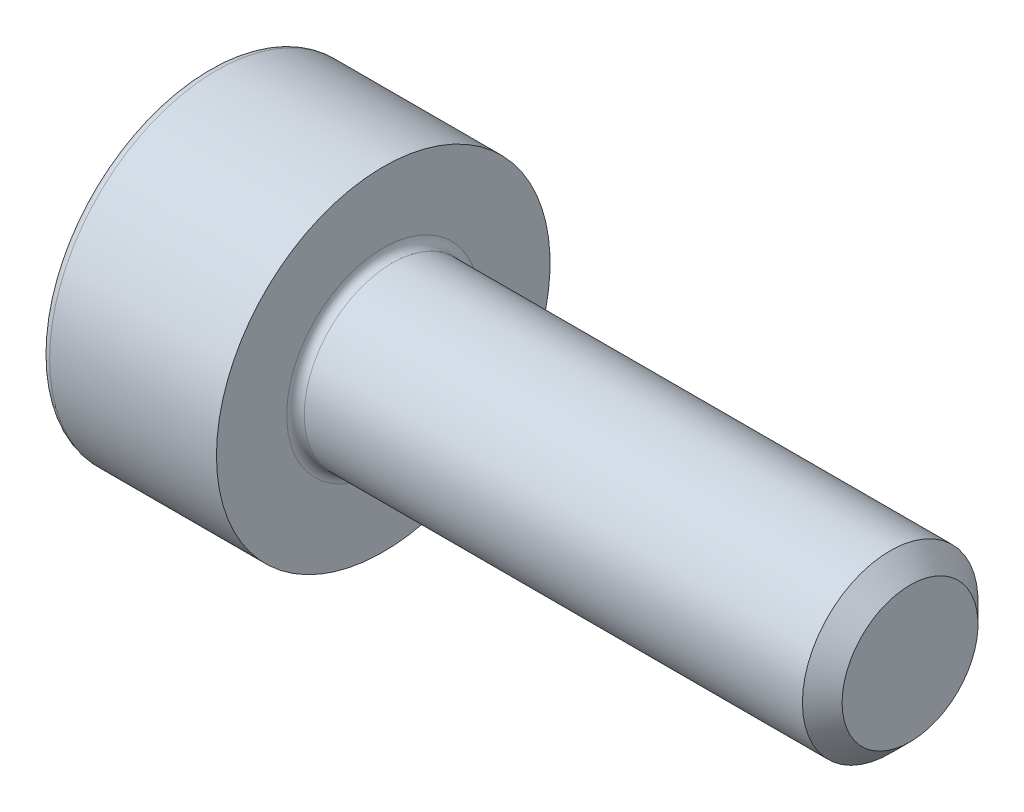
ISO-10303-21;
HEADER;
FILE_DESCRIPTION(('STEP AP214'),'2;1');
FILE_NAME('part.step','',(''),(''),'','','');
FILE_SCHEMA(('AUTOMOTIVE_DESIGN { 1 0 10303 214 1 1 1 1 }'));
ENDSEC;
DATA;
#1=APPLICATION_CONTEXT('core data for automotive mechanical design processes');
#2=APPLICATION_PROTOCOL_DEFINITION('international standard','automotive_design',2000,#1);
#3=PRODUCT_CONTEXT('',#1,'mechanical');
#4=PRODUCT('Part','Part','',(#3));
#5=PRODUCT_RELATED_PRODUCT_CATEGORY('part','',(#4));
#6=PRODUCT_DEFINITION_FORMATION('','',#4);
#7=PRODUCT_DEFINITION_CONTEXT('part definition',#1,'design');
#8=PRODUCT_DEFINITION('design','',#6,#7);
#9=PRODUCT_DEFINITION_SHAPE('','',#8);
#10=(LENGTH_UNIT() NAMED_UNIT(*) SI_UNIT(.MILLI.,.METRE.));
#11=(NAMED_UNIT(*) PLANE_ANGLE_UNIT() SI_UNIT($,.RADIAN.));
#12=(NAMED_UNIT(*) SI_UNIT($,.STERADIAN.) SOLID_ANGLE_UNIT());
#13=UNCERTAINTY_MEASURE_WITH_UNIT(LENGTH_MEASURE(1.E-05),#10,'distance_accuracy_value','');
#14=(GEOMETRIC_REPRESENTATION_CONTEXT(3) GLOBAL_UNCERTAINTY_ASSIGNED_CONTEXT((#13)) GLOBAL_UNIT_ASSIGNED_CONTEXT((#10,
#11,#12)) REPRESENTATION_CONTEXT('',''));
#15=CARTESIAN_POINT('',(0.,0.,0.));
#16=DIRECTION('',(0.,0.,1.));
#17=DIRECTION('',(1.,0.,0.));
#18=AXIS2_PLACEMENT_3D('',#15,#16,#17);
#19=CARTESIAN_POINT('',(0.,0.,0.));
#20=DIRECTION('',(-1.,0.,0.));
#21=DIRECTION('',(0.,0.,1.));
#22=AXIS2_PLACEMENT_3D('',#19,#20,#21);
#23=PLANE('',#22);
#24=DIRECTION('',(0.,-0.5,0.86602540378444));
#25=VECTOR('',#24,1.);
#26=CARTESIAN_POINT('',(0.,0.892006165897969,0.));
#27=LINE('',#26,#25);
#28=CARTESIAN_POINT('',(0.,0.892006165897969,0.));
#29=VERTEX_POINT('',#28);
#30=CARTESIAN_POINT('',(0.,0.446003082948984,0.7725));
#31=VERTEX_POINT('',#30);
#32=EDGE_CURVE('E253',#29,#31,#27,.T.);
#33=ORIENTED_EDGE('',*,*,#32,.T.);
#34=DIRECTION('',(0.,1.,0.));
#35=VECTOR('',#34,1.);
#36=CARTESIAN_POINT('',(0.,-0.446003082948988,0.7725));
#37=LINE('',#36,#35);
#38=CARTESIAN_POINT('',(0.,-0.446003082948988,0.7725));
#39=VERTEX_POINT('',#38);
#40=EDGE_CURVE('E108',#39,#31,#37,.T.);
#41=ORIENTED_EDGE('',*,*,#40,.F.);
#42=DIRECTION('',(0.,-0.5,-0.866025403784438));
#43=VECTOR('',#42,1.);
#44=CARTESIAN_POINT('',(0.,-0.446003082948988,0.7725));
#45=LINE('',#44,#43);
#46=CARTESIAN_POINT('',(0.,-0.892006165897974,0.));
#47=VERTEX_POINT('',#46);
#48=EDGE_CURVE('E256',#39,#47,#45,.T.);
#49=ORIENTED_EDGE('',*,*,#48,.T.);
#50=DIRECTION('',(0.,0.5,-0.86602540378444));
#51=VECTOR('',#50,1.);
#52=CARTESIAN_POINT('',(0.,-0.892006165897974,0.));
#53=LINE('',#52,#51);
#54=CARTESIAN_POINT('',(0.,-0.44600308294899,-0.7725));
#55=VERTEX_POINT('',#54);
#56=EDGE_CURVE('E259',#47,#55,#53,.T.);
#57=ORIENTED_EDGE('',*,*,#56,.T.);
#58=DIRECTION('',(0.,-1.,0.));
#59=VECTOR('',#58,1.);
#60=CARTESIAN_POINT('',(0.,0.446003082948982,-0.7725));
#61=LINE('',#60,#59);
#62=CARTESIAN_POINT('',(0.,0.446003082948982,-0.7725));
#63=VERTEX_POINT('',#62);
#64=EDGE_CURVE('E262',#63,#55,#61,.T.);
#65=ORIENTED_EDGE('',*,*,#64,.F.);
#66=DIRECTION('',(0.,-0.5,-0.866025403784438));
#67=VECTOR('',#66,1.);
#68=CARTESIAN_POINT('',(0.,0.892006165897969,0.));
#69=LINE('',#68,#67);
#70=EDGE_CURVE('E103',#29,#63,#69,.T.);
#71=ORIENTED_EDGE('',*,*,#70,.F.);
#72=EDGE_LOOP('',(#33,#41,#49,#57,#65,#71));
#73=FACE_BOUND('',#72,.T.);
#74=CARTESIAN_POINT('',(0.,0.,0.));
#75=DIRECTION('',(-1.,0.,0.));
#76=DIRECTION('',(0.,0.,1.));
#77=AXIS2_PLACEMENT_3D('',#74,#75,#76);
#78=CIRCLE('',#77,1.8);
#79=CARTESIAN_POINT('',(0.,0.,1.8));
#80=VERTEX_POINT('',#79);
#81=EDGE_CURVE('E24',#80,#80,#78,.T.);
#82=ORIENTED_EDGE('',*,*,#81,.T.);
#83=EDGE_LOOP('',(#82));
#84=FACE_BOUND('',#83,.T.);
#85=ADVANCED_FACE('F16',(#73,#84),#23,.T.);
#86=CARTESIAN_POINT('',(-31.75,0.,0.));
#87=DIRECTION('',(-1.,0.,0.));
#88=DIRECTION('',(0.,0.,1.));
#89=AXIS2_PLACEMENT_3D('',#86,#87,#88);
#90=CYLINDRICAL_SURFACE('',#89,1.9);
#91=CARTESIAN_POINT('',(0.100000000000003,0.,0.));
#92=DIRECTION('',(-1.,0.,0.));
#93=DIRECTION('',(0.,0.,1.));
#94=AXIS2_PLACEMENT_3D('',#91,#92,#93);
#95=CIRCLE('',#94,1.9);
#96=CARTESIAN_POINT('',(0.100000000000003,0.,1.9));
#97=VERTEX_POINT('',#96);
#98=EDGE_CURVE('E11',#97,#97,#95,.F.);
#99=ORIENTED_EDGE('',*,*,#98,.T.);
#100=EDGE_LOOP('',(#99));
#101=FACE_BOUND('',#100,.T.);
#102=CARTESIAN_POINT('',(2.,0.,0.));
#103=DIRECTION('',(-1.,0.,0.));
#104=DIRECTION('',(0.,0.,1.));
#105=AXIS2_PLACEMENT_3D('',#102,#103,#104);
#106=CIRCLE('',#105,1.9);
#107=CARTESIAN_POINT('',(2.,0.,1.9));
#108=VERTEX_POINT('',#107);
#109=EDGE_CURVE('E126',#108,#108,#106,.T.);
#110=ORIENTED_EDGE('',*,*,#109,.T.);
#111=EDGE_LOOP('',(#110));
#112=FACE_BOUND('',#111,.T.);
#113=ADVANCED_FACE('F152',(#101,#112),#90,.T.);
#114=CARTESIAN_POINT('',(2.,1.9,0.));
#115=DIRECTION('',(1.,0.,0.));
#116=DIRECTION('',(0.,0.,-1.));
#117=AXIS2_PLACEMENT_3D('',#114,#115,#116);
#118=PLANE('',#117);
#119=CARTESIAN_POINT('',(2.,0.,0.));
#120=DIRECTION('',(1.,0.,0.));
#121=DIRECTION('',(0.,0.,-1.));
#122=AXIS2_PLACEMENT_3D('',#119,#120,#121);
#123=CIRCLE('',#122,1.1);
#124=CARTESIAN_POINT('',(2.,0.,-1.1));
#125=VERTEX_POINT('',#124);
#126=EDGE_CURVE('E129',#125,#125,#123,.F.);
#127=ORIENTED_EDGE('',*,*,#126,.T.);
#128=EDGE_LOOP('',(#127));
#129=FACE_BOUND('',#128,.T.);
#130=ORIENTED_EDGE('',*,*,#109,.F.);
#131=EDGE_LOOP('',(#130));
#132=FACE_BOUND('',#131,.T.);
#133=ADVANCED_FACE('F159',(#129,#132),#118,.T.);
#134=CARTESIAN_POINT('',(-31.75,0.,0.));
#135=DIRECTION('',(-1.,0.,0.));
#136=DIRECTION('',(0.,0.,1.));
#137=AXIS2_PLACEMENT_3D('',#134,#135,#136);
#138=CYLINDRICAL_SURFACE('',#137,1.);
#139=CARTESIAN_POINT('',(2.1,0.,0.));
#140=DIRECTION('',(1.,0.,0.));
#141=DIRECTION('',(0.,0.,-1.));
#142=AXIS2_PLACEMENT_3D('',#139,#140,#141);
#143=CIRCLE('',#142,1.);
#144=CARTESIAN_POINT('',(2.1,0.,-1.));
#145=VERTEX_POINT('',#144);
#146=EDGE_CURVE('E132',#145,#145,#143,.T.);
#147=ORIENTED_EDGE('',*,*,#146,.T.);
#148=EDGE_LOOP('',(#147));
#149=FACE_BOUND('',#148,.T.);
#150=CARTESIAN_POINT('',(7.774,0.,0.));
#151=DIRECTION('',(-1.,0.,0.));
#152=DIRECTION('',(0.,0.,1.));
#153=AXIS2_PLACEMENT_3D('',#150,#151,#152);
#154=CIRCLE('',#153,0.999999999999986);
#155=CARTESIAN_POINT('',(7.774,0.,0.999999999999986));
#156=VERTEX_POINT('',#155);
#157=EDGE_CURVE('E123',#156,#156,#154,.T.);
#158=ORIENTED_EDGE('',*,*,#157,.T.);
#159=EDGE_LOOP('',(#158));
#160=FACE_BOUND('',#159,.T.);
#161=ADVANCED_FACE('F165',(#149,#160),#138,.T.);
#162=CARTESIAN_POINT('',(8.,0.,0.));
#163=DIRECTION('',(-1.,0.,0.));
#164=DIRECTION('',(0.,0.,1.));
#165=AXIS2_PLACEMENT_3D('',#162,#163,#164);
#166=CONICAL_SURFACE('',#165,0.774,0.785398163397409);
#167=ORIENTED_EDGE('',*,*,#157,.F.);
#168=EDGE_LOOP('',(#167));
#169=FACE_BOUND('',#168,.T.);
#170=CARTESIAN_POINT('',(8.,0.,0.));
#171=DIRECTION('',(-1.,0.,0.));
#172=DIRECTION('',(0.,0.,1.));
#173=AXIS2_PLACEMENT_3D('',#170,#171,#172);
#174=CIRCLE('',#173,0.774);
#175=CARTESIAN_POINT('',(8.,0.,0.774));
#176=VERTEX_POINT('',#175);
#177=EDGE_CURVE('E119',#176,#176,#174,.T.);
#178=ORIENTED_EDGE('',*,*,#177,.T.);
#179=EDGE_LOOP('',(#178));
#180=FACE_BOUND('',#179,.T.);
#181=ADVANCED_FACE('F169',(#169,#180),#166,.T.);
#182=CARTESIAN_POINT('',(8.,0.774,0.));
#183=DIRECTION('',(1.,0.,0.));
#184=DIRECTION('',(0.,0.,-1.));
#185=AXIS2_PLACEMENT_3D('',#182,#183,#184);
#186=PLANE('',#185);
#187=ORIENTED_EDGE('',*,*,#177,.F.);
#188=EDGE_LOOP('',(#187));
#189=FACE_BOUND('',#188,.T.);
#190=ADVANCED_FACE('F148',(#189),#186,.T.);
#191=CARTESIAN_POINT('',(2.1,0.,0.));
#192=DIRECTION('',(1.,0.,0.));
#193=DIRECTION('',(0.,0.,-1.));
#194=AXIS2_PLACEMENT_3D('',#191,#192,#193);
#195=TOROIDAL_SURFACE('',#194,1.1,0.1);
#196=ORIENTED_EDGE('',*,*,#146,.F.);
#197=EDGE_LOOP('',(#196));
#198=FACE_BOUND('',#197,.T.);
#199=ORIENTED_EDGE('',*,*,#126,.F.);
#200=EDGE_LOOP('',(#199));
#201=FACE_BOUND('',#200,.T.);
#202=ADVANCED_FACE('F139',(#198,#201),#195,.F.);
#203=CARTESIAN_POINT('',(0.100000000000003,0.,0.));
#204=DIRECTION('',(-1.,0.,0.));
#205=DIRECTION('',(0.,0.,1.));
#206=AXIS2_PLACEMENT_3D('',#203,#204,#205);
#207=TOROIDAL_SURFACE('',#206,1.8,0.1);
#208=ORIENTED_EDGE('',*,*,#98,.F.);
#209=EDGE_LOOP('',(#208));
#210=FACE_BOUND('',#209,.T.);
#211=ORIENTED_EDGE('',*,*,#81,.F.);
#212=EDGE_LOOP('',(#211));
#213=FACE_BOUND('',#212,.T.);
#214=ADVANCED_FACE('F18',(#210,#213),#207,.T.);
#215=CARTESIAN_POINT('',(1.,0.892006165897969,0.));
#216=DIRECTION('',(0.,-0.86602540378444,-0.5));
#217=DIRECTION('',(0.,0.5,-0.86602540378444));
#218=AXIS2_PLACEMENT_3D('',#215,#216,#217);
#219=PLANE('',#218);
#220=ORIENTED_EDGE('',*,*,#32,.F.);
#221=DIRECTION('',(-1.,0.,0.));
#222=VECTOR('',#221,1.);
#223=CARTESIAN_POINT('',(1.,0.892006165897969,0.));
#224=LINE('',#223,#222);
#225=CARTESIAN_POINT('',(1.,0.892006165897969,0.));
#226=VERTEX_POINT('',#225);
#227=EDGE_CURVE('E252',#226,#29,#224,.T.);
#228=ORIENTED_EDGE('',*,*,#227,.F.);
#229=DIRECTION('',(0.,-0.5,0.86602540378444));
#230=VECTOR('',#229,1.);
#231=CARTESIAN_POINT('',(1.,0.892006165897969,0.));
#232=LINE('',#231,#230);
#233=CARTESIAN_POINT('',(1.,0.66900462442348,0.38625));
#234=VERTEX_POINT('',#233);
#235=EDGE_CURVE('E31',#226,#234,#232,.T.);
#236=ORIENTED_EDGE('',*,*,#235,.T.);
#237=CARTESIAN_POINT('',(1.,0.446003082948984,0.7725));
#238=VERTEX_POINT('',#237);
#239=EDGE_CURVE('E89',#234,#238,#232,.T.);
#240=ORIENTED_EDGE('',*,*,#239,.T.);
#241=DIRECTION('',(-1.,0.,0.));
#242=VECTOR('',#241,1.);
#243=CARTESIAN_POINT('',(1.,0.446003082948984,0.7725));
#244=LINE('',#243,#242);
#245=EDGE_CURVE('E101',#238,#31,#244,.T.);
#246=ORIENTED_EDGE('',*,*,#245,.T.);
#247=EDGE_LOOP('',(#220,#228,#236,#240,#246));
#248=FACE_BOUND('',#247,.T.);
#249=ADVANCED_FACE('F100',(#248),#219,.T.);
#250=CARTESIAN_POINT('',(1.,-0.446003082948988,0.7725));
#251=DIRECTION('',(0.,0.,1.));
#252=DIRECTION('',(0.,-1.,0.));
#253=AXIS2_PLACEMENT_3D('',#250,#251,#252);
#254=PLANE('',#253);
#255=ORIENTED_EDGE('',*,*,#40,.T.);
#256=ORIENTED_EDGE('',*,*,#245,.F.);
#257=DIRECTION('',(0.,1.,0.));
#258=VECTOR('',#257,1.);
#259=CARTESIAN_POINT('',(1.,-0.446003082948988,0.7725));
#260=LINE('',#259,#258);
#261=CARTESIAN_POINT('',(1.,0.,0.7725));
#262=VERTEX_POINT('',#261);
#263=EDGE_CURVE('E87',#262,#238,#260,.T.);
#264=ORIENTED_EDGE('',*,*,#263,.F.);
#265=CARTESIAN_POINT('',(1.,-0.446003082948988,0.7725));
#266=VERTEX_POINT('',#265);
#267=EDGE_CURVE('E97',#266,#262,#260,.T.);
#268=ORIENTED_EDGE('',*,*,#267,.F.);
#269=DIRECTION('',(-1.,0.,0.));
#270=VECTOR('',#269,1.);
#271=CARTESIAN_POINT('',(1.,-0.446003082948988,0.7725));
#272=LINE('',#271,#270);
#273=EDGE_CURVE('E110',#266,#39,#272,.T.);
#274=ORIENTED_EDGE('',*,*,#273,.T.);
#275=EDGE_LOOP('',(#255,#256,#264,#268,#274));
#276=FACE_BOUND('',#275,.T.);
#277=ADVANCED_FACE('F105',(#276),#254,.F.);
#278=CARTESIAN_POINT('',(1.,-0.446003082948988,0.7725));
#279=DIRECTION('',(0.,0.866025403784438,-0.5));
#280=DIRECTION('',(0.,0.5,0.866025403784438));
#281=AXIS2_PLACEMENT_3D('',#278,#279,#280);
#282=PLANE('',#281);
#283=ORIENTED_EDGE('',*,*,#48,.F.);
#284=ORIENTED_EDGE('',*,*,#273,.F.);
#285=DIRECTION('',(0.,-0.5,-0.866025403784438));
#286=VECTOR('',#285,1.);
#287=CARTESIAN_POINT('',(1.,-0.446003082948988,0.7725));
#288=LINE('',#287,#286);
#289=CARTESIAN_POINT('',(1.,-0.669004624423479,0.38625));
#290=VERTEX_POINT('',#289);
#291=EDGE_CURVE('E233',#266,#290,#288,.T.);
#292=ORIENTED_EDGE('',*,*,#291,.T.);
#293=CARTESIAN_POINT('',(1.,-0.892006165897974,0.));
#294=VERTEX_POINT('',#293);
#295=EDGE_CURVE('E235',#290,#294,#288,.T.);
#296=ORIENTED_EDGE('',*,*,#295,.T.);
#297=DIRECTION('',(-1.,0.,0.));
#298=VECTOR('',#297,1.);
#299=CARTESIAN_POINT('',(1.,-0.892006165897974,0.));
#300=LINE('',#299,#298);
#301=EDGE_CURVE('E115',#294,#47,#300,.T.);
#302=ORIENTED_EDGE('',*,*,#301,.T.);
#303=EDGE_LOOP('',(#283,#284,#292,#296,#302));
#304=FACE_BOUND('',#303,.T.);
#305=ADVANCED_FACE('F182',(#304),#282,.T.);
#306=CARTESIAN_POINT('',(1.,-0.892006165897974,0.));
#307=DIRECTION('',(0.,0.86602540378444,0.5));
#308=DIRECTION('',(0.,-0.5,0.86602540378444));
#309=AXIS2_PLACEMENT_3D('',#306,#307,#308);
#310=PLANE('',#309);
#311=ORIENTED_EDGE('',*,*,#56,.F.);
#312=ORIENTED_EDGE('',*,*,#301,.F.);
#313=DIRECTION('',(0.,0.5,-0.86602540378444));
#314=VECTOR('',#313,1.);
#315=CARTESIAN_POINT('',(1.,-0.892006165897974,0.));
#316=LINE('',#315,#314);
#317=CARTESIAN_POINT('',(1.,-0.669004624423483,-0.38625));
#318=VERTEX_POINT('',#317);
#319=EDGE_CURVE('E238',#294,#318,#316,.T.);
#320=ORIENTED_EDGE('',*,*,#319,.T.);
#321=CARTESIAN_POINT('',(1.,-0.44600308294899,-0.7725));
#322=VERTEX_POINT('',#321);
#323=EDGE_CURVE('E242',#318,#322,#316,.T.);
#324=ORIENTED_EDGE('',*,*,#323,.T.);
#325=DIRECTION('',(-1.,0.,0.));
#326=VECTOR('',#325,1.);
#327=CARTESIAN_POINT('',(1.,-0.44600308294899,-0.7725));
#328=LINE('',#327,#326);
#329=EDGE_CURVE('E271',#322,#55,#328,.T.);
#330=ORIENTED_EDGE('',*,*,#329,.T.);
#331=EDGE_LOOP('',(#311,#312,#320,#324,#330));
#332=FACE_BOUND('',#331,.T.);
#333=ADVANCED_FACE('F185',(#332),#310,.T.);
#334=CARTESIAN_POINT('',(1.,0.446003082948982,-0.7725));
#335=DIRECTION('',(0.,0.,-1.));
#336=DIRECTION('',(0.,1.,0.));
#337=AXIS2_PLACEMENT_3D('',#334,#335,#336);
#338=PLANE('',#337);
#339=ORIENTED_EDGE('',*,*,#64,.T.);
#340=ORIENTED_EDGE('',*,*,#329,.F.);
#341=DIRECTION('',(0.,-1.,0.));
#342=VECTOR('',#341,1.);
#343=CARTESIAN_POINT('',(1.,0.446003082948982,-0.7725));
#344=LINE('',#343,#342);
#345=CARTESIAN_POINT('',(1.,0.,-0.7725));
#346=VERTEX_POINT('',#345);
#347=EDGE_CURVE('E246',#346,#322,#344,.T.);
#348=ORIENTED_EDGE('',*,*,#347,.F.);
#349=CARTESIAN_POINT('',(1.,0.446003082948982,-0.7725));
#350=VERTEX_POINT('',#349);
#351=EDGE_CURVE('E247',#350,#346,#344,.T.);
#352=ORIENTED_EDGE('',*,*,#351,.F.);
#353=DIRECTION('',(-1.,0.,0.));
#354=VECTOR('',#353,1.);
#355=CARTESIAN_POINT('',(1.,0.446003082948982,-0.7725));
#356=LINE('',#355,#354);
#357=EDGE_CURVE('E268',#350,#63,#356,.T.);
#358=ORIENTED_EDGE('',*,*,#357,.T.);
#359=EDGE_LOOP('',(#339,#340,#348,#352,#358));
#360=FACE_BOUND('',#359,.T.);
#361=ADVANCED_FACE('F189',(#360),#338,.F.);
#362=CARTESIAN_POINT('',(1.,0.892006165897969,0.));
#363=DIRECTION('',(0.,0.866025403784438,-0.5));
#364=DIRECTION('',(0.,0.5,0.866025403784438));
#365=AXIS2_PLACEMENT_3D('',#362,#363,#364);
#366=PLANE('',#365);
#367=ORIENTED_EDGE('',*,*,#70,.T.);
#368=ORIENTED_EDGE('',*,*,#357,.F.);
#369=DIRECTION('',(0.,-0.5,-0.866025403784438));
#370=VECTOR('',#369,1.);
#371=CARTESIAN_POINT('',(1.,0.892006165897969,0.));
#372=LINE('',#371,#370);
#373=CARTESIAN_POINT('',(1.,0.669004624423477,-0.38625));
#374=VERTEX_POINT('',#373);
#375=EDGE_CURVE('E250',#374,#350,#372,.T.);
#376=ORIENTED_EDGE('',*,*,#375,.F.);
#377=EDGE_CURVE('E224',#226,#374,#372,.T.);
#378=ORIENTED_EDGE('',*,*,#377,.F.);
#379=ORIENTED_EDGE('',*,*,#227,.T.);
#380=EDGE_LOOP('',(#367,#368,#376,#378,#379));
#381=FACE_BOUND('',#380,.T.);
#382=ADVANCED_FACE('F193',(#381),#366,.F.);
#383=CARTESIAN_POINT('',(1.,0.446003082948983,0.7725));
#384=DIRECTION('',(-1.,0.,0.));
#385=DIRECTION('',(0.,0.,1.));
#386=AXIS2_PLACEMENT_3D('',#383,#384,#385);
#387=PLANE('',#386);
#388=CARTESIAN_POINT('',(1.,0.,0.));
#389=DIRECTION('',(-1.,0.,0.));
#390=DIRECTION('',(0.,0.,1.));
#391=AXIS2_PLACEMENT_3D('',#388,#389,#390);
#392=CIRCLE('',#391,0.7725);
#393=EDGE_CURVE('E109',#290,#262,#392,.T.);
#394=ORIENTED_EDGE('',*,*,#393,.F.);
#395=ORIENTED_EDGE('',*,*,#291,.F.);
#396=ORIENTED_EDGE('',*,*,#267,.T.);
#397=EDGE_LOOP('',(#394,#395,#396));
#398=FACE_BOUND('',#397,.T.);
#399=ADVANCED_FACE('F197',(#398),#387,.T.);
#400=EDGE_CURVE('E113',#318,#290,#392,.T.);
#401=ORIENTED_EDGE('',*,*,#400,.F.);
#402=ORIENTED_EDGE('',*,*,#319,.F.);
#403=ORIENTED_EDGE('',*,*,#295,.F.);
#404=EDGE_LOOP('',(#401,#402,#403));
#405=FACE_BOUND('',#404,.T.);
#406=ADVANCED_FACE('F200',(#405),#387,.T.);
#407=EDGE_CURVE('E277',#346,#318,#392,.T.);
#408=ORIENTED_EDGE('',*,*,#407,.F.);
#409=ORIENTED_EDGE('',*,*,#347,.T.);
#410=ORIENTED_EDGE('',*,*,#323,.F.);
#411=EDGE_LOOP('',(#408,#409,#410));
#412=FACE_BOUND('',#411,.T.);
#413=ADVANCED_FACE('F206',(#412),#387,.T.);
#414=EDGE_CURVE('E227',#374,#346,#392,.T.);
#415=ORIENTED_EDGE('',*,*,#414,.F.);
#416=ORIENTED_EDGE('',*,*,#375,.T.);
#417=ORIENTED_EDGE('',*,*,#351,.T.);
#418=EDGE_LOOP('',(#415,#416,#417));
#419=FACE_BOUND('',#418,.T.);
#420=ADVANCED_FACE('F214',(#419),#387,.T.);
#421=EDGE_CURVE('E120',#234,#374,#392,.T.);
#422=ORIENTED_EDGE('',*,*,#421,.F.);
#423=ORIENTED_EDGE('',*,*,#235,.F.);
#424=ORIENTED_EDGE('',*,*,#377,.T.);
#425=EDGE_LOOP('',(#422,#423,#424));
#426=FACE_BOUND('',#425,.T.);
#427=ADVANCED_FACE('F209',(#426),#387,.T.);
#428=EDGE_CURVE('E92',#262,#234,#392,.T.);
#429=ORIENTED_EDGE('',*,*,#428,.F.);
#430=ORIENTED_EDGE('',*,*,#263,.T.);
#431=ORIENTED_EDGE('',*,*,#239,.F.);
#432=EDGE_LOOP('',(#429,#430,#431));
#433=FACE_BOUND('',#432,.T.);
#434=ADVANCED_FACE('F88',(#433),#387,.T.);
#435=CARTESIAN_POINT('',(1.,0.,0.));
#436=DIRECTION('',(-1.,0.,0.));
#437=DIRECTION('',(0.,0.,1.));
#438=AXIS2_PLACEMENT_3D('',#435,#436,#437);
#439=CONICAL_SURFACE('',#438,0.7725,1.04719755119659);
#440=CARTESIAN_POINT('',(1.446003082949,0.,0.));
#441=VERTEX_POINT('',#440);
#442=VERTEX_LOOP('',#441);
#443=FACE_BOUND('',#442,.T.);
#444=ORIENTED_EDGE('',*,*,#428,.T.);
#445=ORIENTED_EDGE('',*,*,#421,.T.);
#446=ORIENTED_EDGE('',*,*,#414,.T.);
#447=ORIENTED_EDGE('',*,*,#407,.T.);
#448=ORIENTED_EDGE('',*,*,#400,.T.);
#449=ORIENTED_EDGE('',*,*,#393,.T.);
#450=EDGE_LOOP('',(#444,#445,#446,#447,#448,#449));
#451=FACE_BOUND('',#450,.T.);
#452=ADVANCED_FACE('F177',(#443,#451),#439,.F.);
#453=CLOSED_SHELL('',(#85,#113,#133,#161,#181,#190,#202,#214,#249,#277,#305,#333,#361,#382,#399,
#406,#413,#420,#427,#434,#452));
#454=MANIFOLD_SOLID_BREP('B1',#453);
#455=ADVANCED_BREP_SHAPE_REPRESENTATION('',(#18,#454),#14);
#456=SHAPE_DEFINITION_REPRESENTATION(#9,#455);
ENDSEC;
END-ISO-10303-21;
